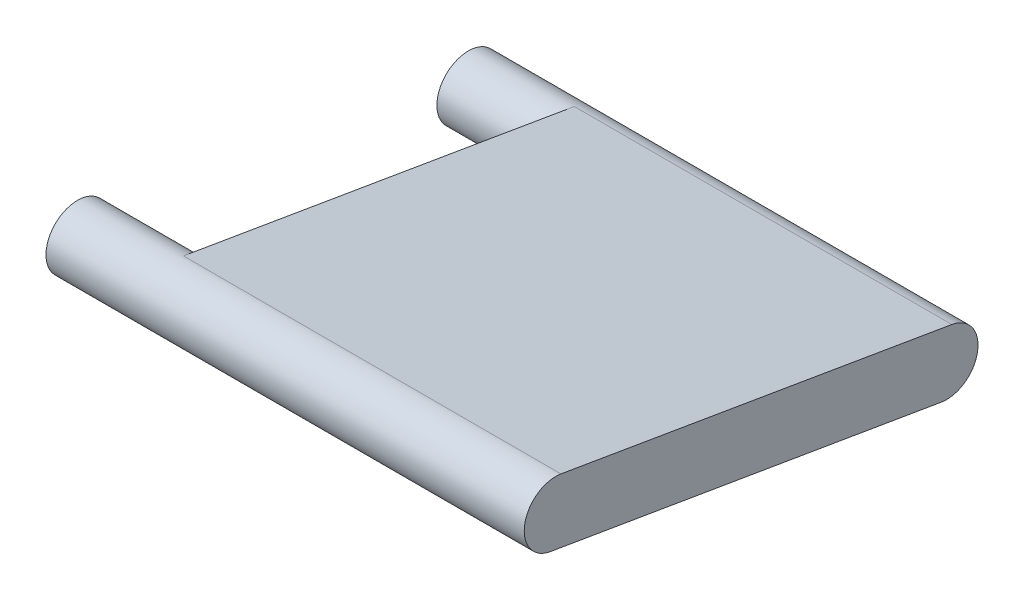
ISO-10303-21;
HEADER;
FILE_DESCRIPTION(('STEP AP214'),'2;1');
FILE_NAME('part.step','',(''),(''),'','','');
FILE_SCHEMA(('AUTOMOTIVE_DESIGN { 1 0 10303 214 1 1 1 1 }'));
ENDSEC;
DATA;
#1=APPLICATION_CONTEXT('core data for automotive mechanical design processes');
#2=APPLICATION_PROTOCOL_DEFINITION('international standard','automotive_design',2000,#1);
#3=PRODUCT_CONTEXT('',#1,'mechanical');
#4=PRODUCT('Part','Part','',(#3));
#5=PRODUCT_RELATED_PRODUCT_CATEGORY('part','',(#4));
#6=PRODUCT_DEFINITION_FORMATION('','',#4);
#7=PRODUCT_DEFINITION_CONTEXT('part definition',#1,'design');
#8=PRODUCT_DEFINITION('design','',#6,#7);
#9=PRODUCT_DEFINITION_SHAPE('','',#8);
#10=(LENGTH_UNIT() NAMED_UNIT(*) SI_UNIT(.MILLI.,.METRE.));
#11=(NAMED_UNIT(*) PLANE_ANGLE_UNIT() SI_UNIT($,.RADIAN.));
#12=(NAMED_UNIT(*) SI_UNIT($,.STERADIAN.) SOLID_ANGLE_UNIT());
#13=UNCERTAINTY_MEASURE_WITH_UNIT(LENGTH_MEASURE(1.E-05),#10,'distance_accuracy_value','');
#14=(GEOMETRIC_REPRESENTATION_CONTEXT(3) GLOBAL_UNCERTAINTY_ASSIGNED_CONTEXT((#13)) GLOBAL_UNIT_ASSIGNED_CONTEXT((#10,
#11,#12)) REPRESENTATION_CONTEXT('',''));
#15=CARTESIAN_POINT('',(0.,0.,0.));
#16=DIRECTION('',(0.,0.,1.));
#17=DIRECTION('',(1.,0.,0.));
#18=AXIS2_PLACEMENT_3D('',#15,#16,#17);
#19=CARTESIAN_POINT('',(38.1,0.,0.));
#20=DIRECTION('',(-1.,0.,0.));
#21=DIRECTION('',(0.,0.,1.));
#22=AXIS2_PLACEMENT_3D('',#19,#20,#21);
#23=CYLINDRICAL_SURFACE('',#22,3.175);
#24=DIRECTION('',(-1.,0.,0.));
#25=VECTOR('',#24,1.);
#26=CARTESIAN_POINT('',(38.1,3.13063447606643,-0.528916607098187));
#27=LINE('',#26,#25);
#28=CARTESIAN_POINT('',(38.1,3.13063447606643,-0.528916607098187));
#29=VERTEX_POINT('',#28);
#30=CARTESIAN_POINT('',(0.,3.13063447606643,-0.528916607098187));
#31=VERTEX_POINT('',#30);
#32=EDGE_CURVE('E105',#29,#31,#27,.T.);
#33=ORIENTED_EDGE('',*,*,#32,.T.);
#34=CARTESIAN_POINT('',(0.,0.,0.));
#35=DIRECTION('',(-1.,0.,0.));
#36=DIRECTION('',(0.,0.,1.));
#37=AXIS2_PLACEMENT_3D('',#34,#35,#36);
#38=CIRCLE('',#37,3.175);
#39=CARTESIAN_POINT('',(0.,-3.13063447606643,0.528916607098187));
#40=VERTEX_POINT('',#39);
#41=EDGE_CURVE('E129',#31,#40,#38,.T.);
#42=ORIENTED_EDGE('',*,*,#41,.T.);
#43=DIRECTION('',(-1.,0.,0.));
#44=VECTOR('',#43,1.);
#45=CARTESIAN_POINT('',(38.1,-3.13063447606643,0.528916607098187));
#46=LINE('',#45,#44);
#47=CARTESIAN_POINT('',(38.1,-3.13063447606643,0.528916607098187));
#48=VERTEX_POINT('',#47);
#49=EDGE_CURVE('E42',#48,#40,#46,.T.);
#50=ORIENTED_EDGE('',*,*,#49,.F.);
#51=CARTESIAN_POINT('',(38.1,0.,0.));
#52=DIRECTION('',(1.,0.,0.));
#53=DIRECTION('',(0.,0.,-1.));
#54=AXIS2_PLACEMENT_3D('',#51,#52,#53);
#55=CIRCLE('',#54,3.175);
#56=EDGE_CURVE('E88',#29,#48,#55,.T.);
#57=ORIENTED_EDGE('',*,*,#56,.F.);
#58=EDGE_LOOP('',(#33,#42,#50,#57));
#59=FACE_BOUND('',#58,.T.);
#60=CARTESIAN_POINT('',(-10.16,0.,0.));
#61=DIRECTION('',(-1.,0.,0.));
#62=DIRECTION('',(0.,0.,1.));
#63=AXIS2_PLACEMENT_3D('',#60,#61,#62);
#64=CIRCLE('',#63,3.175);
#65=CARTESIAN_POINT('',(-10.16,0.,3.175));
#66=VERTEX_POINT('',#65);
#67=EDGE_CURVE('E128',#66,#66,#64,.T.);
#68=ORIENTED_EDGE('',*,*,#67,.F.);
#69=EDGE_LOOP('',(#68));
#70=FACE_BOUND('',#69,.T.);
#71=ADVANCED_FACE('F39',(#59,#70),#23,.T.);
#72=CARTESIAN_POINT('',(38.1,-3.13063447606643,0.528916607098187));
#73=DIRECTION('',(0.,0.986026606635097,-0.16658790774746));
#74=DIRECTION('',(0.,0.16658790774746,0.986026606635097));
#75=AXIS2_PLACEMENT_3D('',#72,#73,#74);
#76=PLANE('',#75);
#77=DIRECTION('',(0.,-0.16658790774746,-0.986026606635097));
#78=VECTOR('',#77,1.);
#79=CARTESIAN_POINT('',(0.,-3.13063447606643,0.528916607098187));
#80=LINE('',#79,#78);
#81=CARTESIAN_POINT('',(0.,-9.79498372550358,-38.9170777913389));
#82=VERTEX_POINT('',#81);
#83=EDGE_CURVE('E96',#40,#82,#80,.T.);
#84=ORIENTED_EDGE('',*,*,#83,.T.);
#85=DIRECTION('',(-1.,0.,0.));
#86=VECTOR('',#85,1.);
#87=CARTESIAN_POINT('',(38.1,-9.79498372550358,-38.9170777913389));
#88=LINE('',#87,#86);
#89=CARTESIAN_POINT('',(38.1,-9.79498372550358,-38.9170777913389));
#90=VERTEX_POINT('',#89);
#91=EDGE_CURVE('E94',#90,#82,#88,.T.);
#92=ORIENTED_EDGE('',*,*,#91,.F.);
#93=DIRECTION('',(0.,-0.16658790774746,-0.986026606635097));
#94=VECTOR('',#93,1.);
#95=CARTESIAN_POINT('',(38.1,-3.13063447606643,0.528916607098187));
#96=LINE('',#95,#94);
#97=EDGE_CURVE('E81',#48,#90,#96,.T.);
#98=ORIENTED_EDGE('',*,*,#97,.F.);
#99=ORIENTED_EDGE('',*,*,#49,.T.);
#100=EDGE_LOOP('',(#84,#92,#98,#99));
#101=FACE_BOUND('',#100,.T.);
#102=ADVANCED_FACE('F95',(#101),#76,.F.);
#103=CARTESIAN_POINT('',(38.1,-6.66434924943715,-39.445994398437));
#104=DIRECTION('',(-1.,0.,0.));
#105=DIRECTION('',(0.,0.,1.));
#106=AXIS2_PLACEMENT_3D('',#103,#104,#105);
#107=CYLINDRICAL_SURFACE('',#106,3.175);
#108=ORIENTED_EDGE('',*,*,#91,.T.);
#109=CARTESIAN_POINT('',(0.,-6.66434924943715,-39.445994398437));
#110=DIRECTION('',(-1.,0.,0.));
#111=DIRECTION('',(0.,0.,1.));
#112=AXIS2_PLACEMENT_3D('',#109,#110,#111);
#113=CIRCLE('',#112,3.175);
#114=CARTESIAN_POINT('',(0.,-3.53371477337072,-39.9749110055352));
#115=VERTEX_POINT('',#114);
#116=EDGE_CURVE('E11',#82,#115,#113,.T.);
#117=ORIENTED_EDGE('',*,*,#116,.T.);
#118=DIRECTION('',(-1.,0.,0.));
#119=VECTOR('',#118,1.);
#120=CARTESIAN_POINT('',(38.1,-3.53371477337072,-39.9749110055352));
#121=LINE('',#120,#119);
#122=CARTESIAN_POINT('',(38.1,-3.53371477337072,-39.9749110055352));
#123=VERTEX_POINT('',#122);
#124=EDGE_CURVE('E99',#123,#115,#121,.T.);
#125=ORIENTED_EDGE('',*,*,#124,.F.);
#126=CARTESIAN_POINT('',(38.1,-6.66434924943715,-39.445994398437));
#127=DIRECTION('',(1.,0.,0.));
#128=DIRECTION('',(0.,0.,-1.));
#129=AXIS2_PLACEMENT_3D('',#126,#127,#128);
#130=CIRCLE('',#129,3.175);
#131=EDGE_CURVE('E85',#90,#123,#130,.T.);
#132=ORIENTED_EDGE('',*,*,#131,.F.);
#133=EDGE_LOOP('',(#108,#117,#125,#132));
#134=FACE_BOUND('',#133,.T.);
#135=CARTESIAN_POINT('',(-10.16,-6.66434924943715,-39.445994398437));
#136=DIRECTION('',(-1.,0.,0.));
#137=DIRECTION('',(0.,0.,1.));
#138=AXIS2_PLACEMENT_3D('',#135,#136,#137);
#139=CIRCLE('',#138,3.175);
#140=CARTESIAN_POINT('',(-10.16,-6.66434924943715,-36.270994398437));
#141=VERTEX_POINT('',#140);
#142=EDGE_CURVE('E111',#141,#141,#139,.T.);
#143=ORIENTED_EDGE('',*,*,#142,.F.);
#144=EDGE_LOOP('',(#143));
#145=FACE_BOUND('',#144,.T.);
#146=ADVANCED_FACE('F100',(#134,#145),#107,.T.);
#147=CARTESIAN_POINT('',(38.1,3.13063447606643,-0.528916607098187));
#148=DIRECTION('',(0.,-0.986026606635097,0.16658790774746));
#149=DIRECTION('',(0.,-0.16658790774746,-0.986026606635097));
#150=AXIS2_PLACEMENT_3D('',#147,#148,#149);
#151=PLANE('',#150);
#152=DIRECTION('',(0.,0.16658790774746,0.986026606635097));
#153=VECTOR('',#152,1.);
#154=CARTESIAN_POINT('',(0.,3.13063447606643,-0.528916607098187));
#155=LINE('',#154,#153);
#156=EDGE_CURVE('E74',#115,#31,#155,.T.);
#157=ORIENTED_EDGE('',*,*,#156,.T.);
#158=ORIENTED_EDGE('',*,*,#32,.F.);
#159=DIRECTION('',(0.,0.16658790774746,0.986026606635097));
#160=VECTOR('',#159,1.);
#161=CARTESIAN_POINT('',(38.1,3.13063447606643,-0.528916607098187));
#162=LINE('',#161,#160);
#163=EDGE_CURVE('E57',#123,#29,#162,.T.);
#164=ORIENTED_EDGE('',*,*,#163,.F.);
#165=ORIENTED_EDGE('',*,*,#124,.T.);
#166=EDGE_LOOP('',(#157,#158,#164,#165));
#167=FACE_BOUND('',#166,.T.);
#168=ADVANCED_FACE('F119',(#167),#151,.F.);
#169=CARTESIAN_POINT('',(38.1,0.,0.));
#170=DIRECTION('',(1.,0.,0.));
#171=DIRECTION('',(0.,0.,-1.));
#172=AXIS2_PLACEMENT_3D('',#169,#170,#171);
#173=PLANE('',#172);
#174=ORIENTED_EDGE('',*,*,#56,.T.);
#175=ORIENTED_EDGE('',*,*,#97,.T.);
#176=ORIENTED_EDGE('',*,*,#131,.T.);
#177=ORIENTED_EDGE('',*,*,#163,.T.);
#178=EDGE_LOOP('',(#174,#175,#176,#177));
#179=FACE_BOUND('',#178,.T.);
#180=ADVANCED_FACE('F83',(#179),#173,.T.);
#181=CARTESIAN_POINT('',(0.,0.,0.));
#182=DIRECTION('',(1.,0.,0.));
#183=DIRECTION('',(0.,0.,-1.));
#184=AXIS2_PLACEMENT_3D('',#181,#182,#183);
#185=PLANE('',#184);
#186=ORIENTED_EDGE('',*,*,#41,.F.);
#187=ORIENTED_EDGE('',*,*,#156,.F.);
#188=ORIENTED_EDGE('',*,*,#116,.F.);
#189=ORIENTED_EDGE('',*,*,#83,.F.);
#190=EDGE_LOOP('',(#186,#187,#188,#189));
#191=FACE_BOUND('',#190,.T.);
#192=ADVANCED_FACE('F148',(#191),#185,.F.);
#193=CARTESIAN_POINT('',(-10.16,-6.66434924943715,-39.445994398437));
#194=DIRECTION('',(-1.,0.,0.));
#195=DIRECTION('',(0.,0.,1.));
#196=AXIS2_PLACEMENT_3D('',#193,#194,#195);
#197=PLANE('',#196);
#198=ORIENTED_EDGE('',*,*,#142,.T.);
#199=EDGE_LOOP('',(#198));
#200=FACE_BOUND('',#199,.T.);
#201=ADVANCED_FACE('F151',(#200),#197,.T.);
#202=CARTESIAN_POINT('',(-10.16,0.,0.));
#203=DIRECTION('',(-1.,0.,0.));
#204=DIRECTION('',(0.,0.,1.));
#205=AXIS2_PLACEMENT_3D('',#202,#203,#204);
#206=PLANE('',#205);
#207=ORIENTED_EDGE('',*,*,#67,.T.);
#208=EDGE_LOOP('',(#207));
#209=FACE_BOUND('',#208,.T.);
#210=ADVANCED_FACE('F136',(#209),#206,.T.);
#211=CLOSED_SHELL('',(#71,#102,#146,#168,#180,#192,#201,#210));
#212=MANIFOLD_SOLID_BREP('B2',#211);
#213=ADVANCED_BREP_SHAPE_REPRESENTATION('',(#18,#212),#14);
#214=SHAPE_DEFINITION_REPRESENTATION(#9,#213);
ENDSEC;
END-ISO-10303-21;
